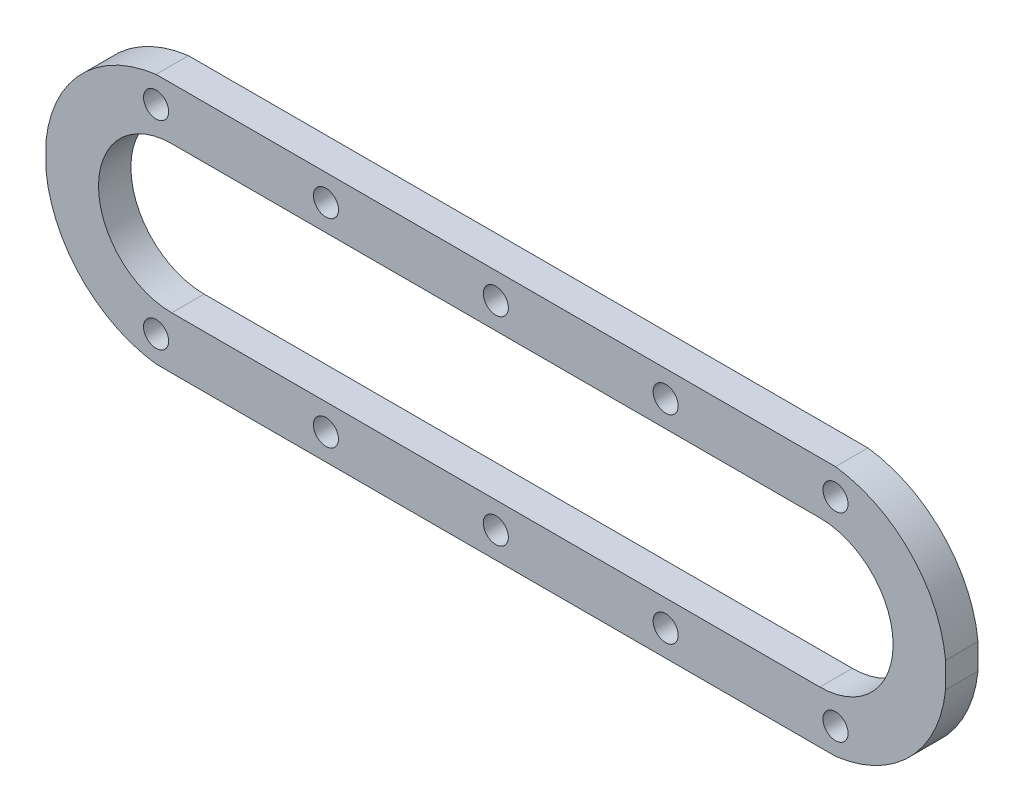
ISO-10303-21;
HEADER;
FILE_DESCRIPTION(('STEP AP214'),'2;1');
FILE_NAME('part.step','',(''),(''),'','','');
FILE_SCHEMA(('AUTOMOTIVE_DESIGN { 1 0 10303 214 1 1 1 1 }'));
ENDSEC;
DATA;
#1=APPLICATION_CONTEXT('core data for automotive mechanical design processes');
#2=APPLICATION_PROTOCOL_DEFINITION('international standard','automotive_design',2000,#1);
#3=PRODUCT_CONTEXT('',#1,'mechanical');
#4=PRODUCT('Part','Part','',(#3));
#5=PRODUCT_RELATED_PRODUCT_CATEGORY('part','',(#4));
#6=PRODUCT_DEFINITION_FORMATION('','',#4);
#7=PRODUCT_DEFINITION_CONTEXT('part definition',#1,'design');
#8=PRODUCT_DEFINITION('design','',#6,#7);
#9=PRODUCT_DEFINITION_SHAPE('','',#8);
#10=(LENGTH_UNIT() NAMED_UNIT(*) SI_UNIT(.MILLI.,.METRE.));
#11=(NAMED_UNIT(*) PLANE_ANGLE_UNIT() SI_UNIT($,.RADIAN.));
#12=(NAMED_UNIT(*) SI_UNIT($,.STERADIAN.) SOLID_ANGLE_UNIT());
#13=UNCERTAINTY_MEASURE_WITH_UNIT(LENGTH_MEASURE(1.E-05),#10,'distance_accuracy_value','');
#14=(GEOMETRIC_REPRESENTATION_CONTEXT(3) GLOBAL_UNCERTAINTY_ASSIGNED_CONTEXT((#13)) GLOBAL_UNIT_ASSIGNED_CONTEXT((#10,
#11,#12)) REPRESENTATION_CONTEXT('',''));
#15=CARTESIAN_POINT('',(0.,0.,0.));
#16=DIRECTION('',(0.,0.,1.));
#17=DIRECTION('',(1.,0.,0.));
#18=AXIS2_PLACEMENT_3D('',#15,#16,#17);
#19=CARTESIAN_POINT('',(0.,0.,0.));
#20=DIRECTION('',(0.,0.,-1.));
#21=DIRECTION('',(-1.,0.,0.));
#22=AXIS2_PLACEMENT_3D('',#19,#20,#21);
#23=PLANE('',#22);
#24=CARTESIAN_POINT('',(-66.5658073569615,19.46275,0.));
#25=DIRECTION('',(0.,0.,1.));
#26=DIRECTION('',(1.,0.,0.));
#27=AXIS2_PLACEMENT_3D('',#24,#25,#26);
#28=CIRCLE('',#27,2.45745);
#29=CARTESIAN_POINT('',(-64.1083573569615,19.46275,0.));
#30=VERTEX_POINT('',#29);
#31=EDGE_CURVE('E272',#30,#30,#28,.T.);
#32=ORIENTED_EDGE('',*,*,#31,.T.);
#33=EDGE_LOOP('',(#32));
#34=FACE_BOUND('',#33,.T.);
#35=CARTESIAN_POINT('',(-33.2829036784807,19.46275,0.));
#36=DIRECTION('',(0.,0.,1.));
#37=DIRECTION('',(1.,0.,0.));
#38=AXIS2_PLACEMENT_3D('',#35,#36,#37);
#39=CIRCLE('',#38,2.45745);
#40=CARTESIAN_POINT('',(-30.8254536784807,19.46275,0.));
#41=VERTEX_POINT('',#40);
#42=EDGE_CURVE('E266',#41,#41,#39,.T.);
#43=ORIENTED_EDGE('',*,*,#42,.T.);
#44=EDGE_LOOP('',(#43));
#45=FACE_BOUND('',#44,.T.);
#46=CARTESIAN_POINT('',(1.11022302462516E-13,19.46275,0.));
#47=DIRECTION('',(0.,0.,1.));
#48=DIRECTION('',(1.,0.,0.));
#49=AXIS2_PLACEMENT_3D('',#46,#47,#48);
#50=CIRCLE('',#49,2.45745);
#51=CARTESIAN_POINT('',(2.45745000000011,19.46275,0.));
#52=VERTEX_POINT('',#51);
#53=EDGE_CURVE('E260',#52,#52,#50,.T.);
#54=ORIENTED_EDGE('',*,*,#53,.T.);
#55=EDGE_LOOP('',(#54));
#56=FACE_BOUND('',#55,.T.);
#57=CARTESIAN_POINT('',(33.2829036784809,19.46275,0.));
#58=DIRECTION('',(0.,0.,1.));
#59=DIRECTION('',(1.,0.,0.));
#60=AXIS2_PLACEMENT_3D('',#57,#58,#59);
#61=CIRCLE('',#60,2.45745);
#62=CARTESIAN_POINT('',(35.7403536784809,19.46275,0.));
#63=VERTEX_POINT('',#62);
#64=EDGE_CURVE('E254',#63,#63,#61,.T.);
#65=ORIENTED_EDGE('',*,*,#64,.T.);
#66=EDGE_LOOP('',(#65));
#67=FACE_BOUND('',#66,.T.);
#68=CARTESIAN_POINT('',(66.5658073569617,19.46275,0.));
#69=DIRECTION('',(0.,0.,1.));
#70=DIRECTION('',(1.,0.,0.));
#71=AXIS2_PLACEMENT_3D('',#68,#69,#70);
#72=CIRCLE('',#71,2.45745);
#73=CARTESIAN_POINT('',(69.0232573569617,19.46275,0.));
#74=VERTEX_POINT('',#73);
#75=EDGE_CURVE('E248',#74,#74,#72,.T.);
#76=ORIENTED_EDGE('',*,*,#75,.T.);
#77=EDGE_LOOP('',(#76));
#78=FACE_BOUND('',#77,.T.);
#79=CARTESIAN_POINT('',(66.5658073569617,-19.46275,0.));
#80=DIRECTION('',(0.,0.,1.));
#81=DIRECTION('',(1.,0.,0.));
#82=AXIS2_PLACEMENT_3D('',#79,#80,#81);
#83=CIRCLE('',#82,2.45745);
#84=CARTESIAN_POINT('',(69.0232573569617,-19.46275,0.));
#85=VERTEX_POINT('',#84);
#86=EDGE_CURVE('E242',#85,#85,#83,.T.);
#87=ORIENTED_EDGE('',*,*,#86,.T.);
#88=EDGE_LOOP('',(#87));
#89=FACE_BOUND('',#88,.T.);
#90=CARTESIAN_POINT('',(33.2829036784809,-19.46275,0.));
#91=DIRECTION('',(0.,0.,1.));
#92=DIRECTION('',(1.,0.,0.));
#93=AXIS2_PLACEMENT_3D('',#90,#91,#92);
#94=CIRCLE('',#93,2.45745);
#95=CARTESIAN_POINT('',(35.7403536784809,-19.46275,0.));
#96=VERTEX_POINT('',#95);
#97=EDGE_CURVE('E236',#96,#96,#94,.T.);
#98=ORIENTED_EDGE('',*,*,#97,.T.);
#99=EDGE_LOOP('',(#98));
#100=FACE_BOUND('',#99,.T.);
#101=DIRECTION('',(1.,0.,0.));
#102=VECTOR('',#101,1.);
#103=CARTESIAN_POINT('',(88.1380000000001,-24.5745,0.));
#104=LINE('',#103,#102);
#105=CARTESIAN_POINT('',(-66.5658073569614,-24.5745,0.));
#106=VERTEX_POINT('',#105);
#107=CARTESIAN_POINT('',(66.5658073569613,-24.5745,0.));
#108=VERTEX_POINT('',#107);
#109=EDGE_CURVE('E144',#106,#108,#104,.T.);
#110=ORIENTED_EDGE('',*,*,#109,.F.);
#111=CARTESIAN_POINT('',(-63.5,0.,0.));
#112=DIRECTION('',(0.,0.,1.));
#113=DIRECTION('',(1.,0.,0.));
#114=AXIS2_PLACEMENT_3D('',#111,#112,#113);
#115=CIRCLE('',#114,24.765);
#116=CARTESIAN_POINT('',(-88.138,-2.50483153126135,0.));
#117=VERTEX_POINT('',#116);
#118=EDGE_CURVE('E211',#117,#106,#115,.T.);
#119=ORIENTED_EDGE('',*,*,#118,.F.);
#120=DIRECTION('',(0.,-1.,0.));
#121=VECTOR('',#120,1.);
#122=CARTESIAN_POINT('',(-88.1379999999999,24.5745,0.));
#123=LINE('',#122,#121);
#124=CARTESIAN_POINT('',(-88.1379999999999,2.50483153126137,0.));
#125=VERTEX_POINT('',#124);
#126=EDGE_CURVE('E147',#125,#117,#123,.T.);
#127=ORIENTED_EDGE('',*,*,#126,.F.);
#128=CARTESIAN_POINT('',(-63.5,0.,0.));
#129=DIRECTION('',(0.,0.,1.));
#130=DIRECTION('',(1.,0.,0.));
#131=AXIS2_PLACEMENT_3D('',#128,#129,#130);
#132=CIRCLE('',#131,24.765);
#133=CARTESIAN_POINT('',(-66.5658073569615,24.5745,0.));
#134=VERTEX_POINT('',#133);
#135=EDGE_CURVE('E194',#134,#125,#132,.T.);
#136=ORIENTED_EDGE('',*,*,#135,.F.);
#137=DIRECTION('',(-1.,0.,0.));
#138=VECTOR('',#137,1.);
#139=CARTESIAN_POINT('',(88.1380000000001,24.5745,0.));
#140=LINE('',#139,#138);
#141=CARTESIAN_POINT('',(66.5658073569617,24.5745,0.));
#142=VERTEX_POINT('',#141);
#143=EDGE_CURVE('E39',#142,#134,#140,.T.);
#144=ORIENTED_EDGE('',*,*,#143,.F.);
#145=CARTESIAN_POINT('',(63.5,0.,0.));
#146=DIRECTION('',(0.,0.,1.));
#147=DIRECTION('',(1.,0.,0.));
#148=AXIS2_PLACEMENT_3D('',#145,#146,#147);
#149=CIRCLE('',#148,24.765);
#150=CARTESIAN_POINT('',(88.138,2.50483153126059,0.));
#151=VERTEX_POINT('',#150);
#152=EDGE_CURVE('E143',#142,#151,#149,.F.);
#153=ORIENTED_EDGE('',*,*,#152,.T.);
#154=DIRECTION('',(0.,1.,0.));
#155=VECTOR('',#154,1.);
#156=CARTESIAN_POINT('',(88.1380000000001,24.5745,0.));
#157=LINE('',#156,#155);
#158=CARTESIAN_POINT('',(88.1380000000001,-2.50483153126051,0.));
#159=VERTEX_POINT('',#158);
#160=EDGE_CURVE('E138',#159,#151,#157,.T.);
#161=ORIENTED_EDGE('',*,*,#160,.F.);
#162=CARTESIAN_POINT('',(63.5,0.,0.));
#163=DIRECTION('',(0.,0.,1.));
#164=DIRECTION('',(1.,0.,0.));
#165=AXIS2_PLACEMENT_3D('',#162,#163,#164);
#166=CIRCLE('',#165,24.765);
#167=EDGE_CURVE('E123',#159,#108,#166,.F.);
#168=ORIENTED_EDGE('',*,*,#167,.T.);
#169=EDGE_LOOP('',(#110,#119,#127,#136,#144,#153,#161,#168));
#170=FACE_BOUND('',#169,.T.);
#171=CARTESIAN_POINT('',(63.5,0.,0.));
#172=DIRECTION('',(0.,0.,1.));
#173=DIRECTION('',(1.,0.,0.));
#174=AXIS2_PLACEMENT_3D('',#171,#172,#173);
#175=CIRCLE('',#174,14.351);
#176=CARTESIAN_POINT('',(63.5,-14.351,0.));
#177=VERTEX_POINT('',#176);
#178=CARTESIAN_POINT('',(63.5,14.351,0.));
#179=VERTEX_POINT('',#178);
#180=EDGE_CURVE('E171',#177,#179,#175,.T.);
#181=ORIENTED_EDGE('',*,*,#180,.T.);
#182=DIRECTION('',(-1.,0.,0.));
#183=VECTOR('',#182,1.);
#184=CARTESIAN_POINT('',(63.5,14.351,0.));
#185=LINE('',#184,#183);
#186=CARTESIAN_POINT('',(-63.5,14.351,0.));
#187=VERTEX_POINT('',#186);
#188=EDGE_CURVE('E186',#179,#187,#185,.T.);
#189=ORIENTED_EDGE('',*,*,#188,.T.);
#190=CARTESIAN_POINT('',(-63.5,0.,0.));
#191=DIRECTION('',(0.,0.,1.));
#192=DIRECTION('',(1.,0.,0.));
#193=AXIS2_PLACEMENT_3D('',#190,#191,#192);
#194=CIRCLE('',#193,14.351);
#195=CARTESIAN_POINT('',(-63.5,-14.351,0.));
#196=VERTEX_POINT('',#195);
#197=EDGE_CURVE('E183',#187,#196,#194,.T.);
#198=ORIENTED_EDGE('',*,*,#197,.T.);
#199=DIRECTION('',(1.,0.,0.));
#200=VECTOR('',#199,1.);
#201=CARTESIAN_POINT('',(63.5,-14.351,0.));
#202=LINE('',#201,#200);
#203=EDGE_CURVE('E163',#196,#177,#202,.T.);
#204=ORIENTED_EDGE('',*,*,#203,.T.);
#205=EDGE_LOOP('',(#181,#189,#198,#204));
#206=FACE_BOUND('',#205,.T.);
#207=CARTESIAN_POINT('',(-66.5658073569615,-19.46275,0.));
#208=DIRECTION('',(0.,0.,1.));
#209=DIRECTION('',(1.,0.,0.));
#210=AXIS2_PLACEMENT_3D('',#207,#208,#209);
#211=CIRCLE('',#210,2.45745);
#212=CARTESIAN_POINT('',(-64.1083573569615,-19.46275,0.));
#213=VERTEX_POINT('',#212);
#214=EDGE_CURVE('E217',#213,#213,#211,.T.);
#215=ORIENTED_EDGE('',*,*,#214,.T.);
#216=EDGE_LOOP('',(#215));
#217=FACE_BOUND('',#216,.T.);
#218=CARTESIAN_POINT('',(-33.2829036784807,-19.46275,0.));
#219=DIRECTION('',(0.,0.,1.));
#220=DIRECTION('',(1.,0.,0.));
#221=AXIS2_PLACEMENT_3D('',#218,#219,#220);
#222=CIRCLE('',#221,2.45745);
#223=CARTESIAN_POINT('',(-30.8254536784807,-19.46275,0.));
#224=VERTEX_POINT('',#223);
#225=EDGE_CURVE('E224',#224,#224,#222,.T.);
#226=ORIENTED_EDGE('',*,*,#225,.T.);
#227=EDGE_LOOP('',(#226));
#228=FACE_BOUND('',#227,.T.);
#229=CARTESIAN_POINT('',(0.,-19.46275,0.));
#230=DIRECTION('',(0.,0.,1.));
#231=DIRECTION('',(1.,0.,0.));
#232=AXIS2_PLACEMENT_3D('',#229,#230,#231);
#233=CIRCLE('',#232,2.45745);
#234=CARTESIAN_POINT('',(2.45744999999999,-19.46275,0.));
#235=VERTEX_POINT('',#234);
#236=EDGE_CURVE('E230',#235,#235,#233,.T.);
#237=ORIENTED_EDGE('',*,*,#236,.T.);
#238=EDGE_LOOP('',(#237));
#239=FACE_BOUND('',#238,.T.);
#240=ADVANCED_FACE('F35',(#34,#45,#56,#67,#78,#89,#100,#170,#206,#217,#228,#239),#23,.T.);
#241=CARTESIAN_POINT('',(-88.1379999999999,24.5745,6.35));
#242=DIRECTION('',(1.,0.,0.));
#243=DIRECTION('',(0.,1.,0.));
#244=AXIS2_PLACEMENT_3D('',#241,#242,#243);
#245=PLANE('',#244);
#246=DIRECTION('',(0.,0.,1.));
#247=VECTOR('',#246,1.);
#248=CARTESIAN_POINT('',(-88.1379999999999,-2.50483153126135,0.));
#249=LINE('',#248,#247);
#250=CARTESIAN_POINT('',(-88.1379999999999,-2.50483153126135,6.35));
#251=VERTEX_POINT('',#250);
#252=EDGE_CURVE('E208',#117,#251,#249,.T.);
#253=ORIENTED_EDGE('',*,*,#252,.T.);
#254=DIRECTION('',(0.,-1.,0.));
#255=VECTOR('',#254,1.);
#256=CARTESIAN_POINT('',(-88.1379999999999,24.5745,6.35));
#257=LINE('',#256,#255);
#258=CARTESIAN_POINT('',(-88.1379999999999,2.50483153126137,6.35));
#259=VERTEX_POINT('',#258);
#260=EDGE_CURVE('E146',#259,#251,#257,.T.);
#261=ORIENTED_EDGE('',*,*,#260,.F.);
#262=DIRECTION('',(0.,0.,1.));
#263=VECTOR('',#262,1.);
#264=CARTESIAN_POINT('',(-88.1379999999999,2.50483153126137,0.));
#265=LINE('',#264,#263);
#266=EDGE_CURVE('E180',#125,#259,#265,.T.);
#267=ORIENTED_EDGE('',*,*,#266,.F.);
#268=ORIENTED_EDGE('',*,*,#126,.T.);
#269=EDGE_LOOP('',(#253,#261,#267,#268));
#270=FACE_BOUND('',#269,.T.);
#271=ADVANCED_FACE('F37',(#270),#245,.F.);
#272=CARTESIAN_POINT('',(88.1380000000001,-24.5745,6.35));
#273=DIRECTION('',(0.,1.,0.));
#274=DIRECTION('',(-1.,0.,0.));
#275=AXIS2_PLACEMENT_3D('',#272,#273,#274);
#276=PLANE('',#275);
#277=DIRECTION('',(0.,0.,1.));
#278=VECTOR('',#277,1.);
#279=CARTESIAN_POINT('',(-66.5658073569614,-24.5745,0.));
#280=LINE('',#279,#278);
#281=CARTESIAN_POINT('',(-66.5658073569614,-24.5745,6.35));
#282=VERTEX_POINT('',#281);
#283=EDGE_CURVE('E199',#106,#282,#280,.T.);
#284=ORIENTED_EDGE('',*,*,#283,.F.);
#285=ORIENTED_EDGE('',*,*,#109,.T.);
#286=DIRECTION('',(0.,0.,1.));
#287=VECTOR('',#286,1.);
#288=CARTESIAN_POINT('',(66.5658073569613,-24.5745,0.));
#289=LINE('',#288,#287);
#290=CARTESIAN_POINT('',(66.5658073569613,-24.5745,6.35));
#291=VERTEX_POINT('',#290);
#292=EDGE_CURVE('E52',#108,#291,#289,.T.);
#293=ORIENTED_EDGE('',*,*,#292,.T.);
#294=DIRECTION('',(1.,0.,0.));
#295=VECTOR('',#294,1.);
#296=CARTESIAN_POINT('',(88.1380000000001,-24.5745,6.35));
#297=LINE('',#296,#295);
#298=EDGE_CURVE('E154',#282,#291,#297,.T.);
#299=ORIENTED_EDGE('',*,*,#298,.F.);
#300=EDGE_LOOP('',(#284,#285,#293,#299));
#301=FACE_BOUND('',#300,.T.);
#302=ADVANCED_FACE('F313',(#301),#276,.F.);
#303=CARTESIAN_POINT('',(88.1380000000001,24.5745,6.35));
#304=DIRECTION('',(0.,-1.,0.));
#305=DIRECTION('',(1.,0.,0.));
#306=AXIS2_PLACEMENT_3D('',#303,#304,#305);
#307=PLANE('',#306);
#308=DIRECTION('',(-1.,0.,0.));
#309=VECTOR('',#308,1.);
#310=CARTESIAN_POINT('',(88.1380000000001,24.5745,6.35));
#311=LINE('',#310,#309);
#312=CARTESIAN_POINT('',(66.5658073569617,24.5745,6.35));
#313=VERTEX_POINT('',#312);
#314=CARTESIAN_POINT('',(-66.5658073569615,24.5745,6.35));
#315=VERTEX_POINT('',#314);
#316=EDGE_CURVE('E11',#313,#315,#311,.T.);
#317=ORIENTED_EDGE('',*,*,#316,.F.);
#318=DIRECTION('',(0.,0.,1.));
#319=VECTOR('',#318,1.);
#320=CARTESIAN_POINT('',(66.5658073569617,24.5745,0.));
#321=LINE('',#320,#319);
#322=EDGE_CURVE('E201',#142,#313,#321,.T.);
#323=ORIENTED_EDGE('',*,*,#322,.F.);
#324=ORIENTED_EDGE('',*,*,#143,.T.);
#325=DIRECTION('',(0.,0.,1.));
#326=VECTOR('',#325,1.);
#327=CARTESIAN_POINT('',(-66.5658073569615,24.5745,0.));
#328=LINE('',#327,#326);
#329=EDGE_CURVE('E191',#134,#315,#328,.T.);
#330=ORIENTED_EDGE('',*,*,#329,.T.);
#331=EDGE_LOOP('',(#317,#323,#324,#330));
#332=FACE_BOUND('',#331,.T.);
#333=ADVANCED_FACE('F284',(#332),#307,.F.);
#334=CARTESIAN_POINT('',(0.,0.,6.35));
#335=DIRECTION('',(0.,0.,-1.));
#336=DIRECTION('',(-1.,0.,0.));
#337=AXIS2_PLACEMENT_3D('',#334,#335,#336);
#338=PLANE('',#337);
#339=CARTESIAN_POINT('',(-66.5658073569615,19.46275,6.35));
#340=DIRECTION('',(0.,0.,1.));
#341=DIRECTION('',(1.,0.,0.));
#342=AXIS2_PLACEMENT_3D('',#339,#340,#341);
#343=CIRCLE('',#342,2.45744999999999);
#344=CARTESIAN_POINT('',(-64.1083573569615,19.46275,6.35));
#345=VERTEX_POINT('',#344);
#346=EDGE_CURVE('E275',#345,#345,#343,.T.);
#347=ORIENTED_EDGE('',*,*,#346,.F.);
#348=EDGE_LOOP('',(#347));
#349=FACE_BOUND('',#348,.T.);
#350=CARTESIAN_POINT('',(-33.2829036784807,19.46275,6.35));
#351=DIRECTION('',(0.,0.,1.));
#352=DIRECTION('',(1.,0.,0.));
#353=AXIS2_PLACEMENT_3D('',#350,#351,#352);
#354=CIRCLE('',#353,2.45744999999999);
#355=CARTESIAN_POINT('',(-30.8254536784807,19.46275,6.35));
#356=VERTEX_POINT('',#355);
#357=EDGE_CURVE('E269',#356,#356,#354,.T.);
#358=ORIENTED_EDGE('',*,*,#357,.F.);
#359=EDGE_LOOP('',(#358));
#360=FACE_BOUND('',#359,.T.);
#361=CARTESIAN_POINT('',(1.11022302462516E-13,19.46275,6.35));
#362=DIRECTION('',(0.,0.,1.));
#363=DIRECTION('',(1.,0.,0.));
#364=AXIS2_PLACEMENT_3D('',#361,#362,#363);
#365=CIRCLE('',#364,2.45744999999999);
#366=CARTESIAN_POINT('',(2.4574500000001,19.46275,6.35));
#367=VERTEX_POINT('',#366);
#368=EDGE_CURVE('E263',#367,#367,#365,.T.);
#369=ORIENTED_EDGE('',*,*,#368,.F.);
#370=EDGE_LOOP('',(#369));
#371=FACE_BOUND('',#370,.T.);
#372=CARTESIAN_POINT('',(33.2829036784809,19.46275,6.35));
#373=DIRECTION('',(0.,0.,1.));
#374=DIRECTION('',(1.,0.,0.));
#375=AXIS2_PLACEMENT_3D('',#372,#373,#374);
#376=CIRCLE('',#375,2.45744999999999);
#377=CARTESIAN_POINT('',(35.7403536784809,19.46275,6.35));
#378=VERTEX_POINT('',#377);
#379=EDGE_CURVE('E257',#378,#378,#376,.T.);
#380=ORIENTED_EDGE('',*,*,#379,.F.);
#381=EDGE_LOOP('',(#380));
#382=FACE_BOUND('',#381,.T.);
#383=CARTESIAN_POINT('',(66.5658073569617,19.46275,6.35));
#384=DIRECTION('',(0.,0.,1.));
#385=DIRECTION('',(1.,0.,0.));
#386=AXIS2_PLACEMENT_3D('',#383,#384,#385);
#387=CIRCLE('',#386,2.45744999999999);
#388=CARTESIAN_POINT('',(69.0232573569617,19.46275,6.35));
#389=VERTEX_POINT('',#388);
#390=EDGE_CURVE('E251',#389,#389,#387,.T.);
#391=ORIENTED_EDGE('',*,*,#390,.F.);
#392=EDGE_LOOP('',(#391));
#393=FACE_BOUND('',#392,.T.);
#394=CARTESIAN_POINT('',(66.5658073569617,-19.46275,6.35));
#395=DIRECTION('',(0.,0.,1.));
#396=DIRECTION('',(1.,0.,0.));
#397=AXIS2_PLACEMENT_3D('',#394,#395,#396);
#398=CIRCLE('',#397,2.45744999999999);
#399=CARTESIAN_POINT('',(69.0232573569617,-19.46275,6.35));
#400=VERTEX_POINT('',#399);
#401=EDGE_CURVE('E245',#400,#400,#398,.T.);
#402=ORIENTED_EDGE('',*,*,#401,.F.);
#403=EDGE_LOOP('',(#402));
#404=FACE_BOUND('',#403,.T.);
#405=CARTESIAN_POINT('',(33.2829036784809,-19.46275,6.35));
#406=DIRECTION('',(0.,0.,1.));
#407=DIRECTION('',(1.,0.,0.));
#408=AXIS2_PLACEMENT_3D('',#405,#406,#407);
#409=CIRCLE('',#408,2.45744999999999);
#410=CARTESIAN_POINT('',(35.7403536784809,-19.46275,6.35));
#411=VERTEX_POINT('',#410);
#412=EDGE_CURVE('E239',#411,#411,#409,.T.);
#413=ORIENTED_EDGE('',*,*,#412,.F.);
#414=EDGE_LOOP('',(#413));
#415=FACE_BOUND('',#414,.T.);
#416=CARTESIAN_POINT('',(0.,-19.46275,6.35));
#417=DIRECTION('',(0.,0.,1.));
#418=DIRECTION('',(1.,0.,0.));
#419=AXIS2_PLACEMENT_3D('',#416,#417,#418);
#420=CIRCLE('',#419,2.45744999999999);
#421=CARTESIAN_POINT('',(2.45744999999998,-19.46275,6.35));
#422=VERTEX_POINT('',#421);
#423=EDGE_CURVE('E233',#422,#422,#420,.T.);
#424=ORIENTED_EDGE('',*,*,#423,.F.);
#425=EDGE_LOOP('',(#424));
#426=FACE_BOUND('',#425,.T.);
#427=CARTESIAN_POINT('',(-33.2829036784807,-19.46275,6.35));
#428=DIRECTION('',(0.,0.,1.));
#429=DIRECTION('',(1.,0.,0.));
#430=AXIS2_PLACEMENT_3D('',#427,#428,#429);
#431=CIRCLE('',#430,2.45744999999999);
#432=CARTESIAN_POINT('',(-30.8254536784807,-19.46275,6.35));
#433=VERTEX_POINT('',#432);
#434=EDGE_CURVE('E227',#433,#433,#431,.T.);
#435=ORIENTED_EDGE('',*,*,#434,.F.);
#436=EDGE_LOOP('',(#435));
#437=FACE_BOUND('',#436,.T.);
#438=CARTESIAN_POINT('',(-66.5658073569615,-19.46275,6.35));
#439=DIRECTION('',(0.,0.,1.));
#440=DIRECTION('',(1.,0.,0.));
#441=AXIS2_PLACEMENT_3D('',#438,#439,#440);
#442=CIRCLE('',#441,2.45744999999999);
#443=CARTESIAN_POINT('',(-64.1083573569615,-19.46275,6.35));
#444=VERTEX_POINT('',#443);
#445=EDGE_CURVE('E221',#444,#444,#442,.T.);
#446=ORIENTED_EDGE('',*,*,#445,.F.);
#447=EDGE_LOOP('',(#446));
#448=FACE_BOUND('',#447,.T.);
#449=DIRECTION('',(-1.,0.,0.));
#450=VECTOR('',#449,1.);
#451=CARTESIAN_POINT('',(63.5,14.351,6.35));
#452=LINE('',#451,#450);
#453=CARTESIAN_POINT('',(63.5,14.351,6.35));
#454=VERTEX_POINT('',#453);
#455=CARTESIAN_POINT('',(-63.5,14.351,6.35));
#456=VERTEX_POINT('',#455);
#457=EDGE_CURVE('E175',#454,#456,#452,.T.);
#458=ORIENTED_EDGE('',*,*,#457,.F.);
#459=CARTESIAN_POINT('',(63.5,0.,6.35));
#460=DIRECTION('',(0.,0.,1.));
#461=DIRECTION('',(1.,0.,0.));
#462=AXIS2_PLACEMENT_3D('',#459,#460,#461);
#463=CIRCLE('',#462,14.351);
#464=CARTESIAN_POINT('',(63.5,-14.351,6.35));
#465=VERTEX_POINT('',#464);
#466=EDGE_CURVE('E178',#465,#454,#463,.T.);
#467=ORIENTED_EDGE('',*,*,#466,.F.);
#468=DIRECTION('',(1.,0.,0.));
#469=VECTOR('',#468,1.);
#470=CARTESIAN_POINT('',(63.5,-14.351,6.35));
#471=LINE('',#470,#469);
#472=CARTESIAN_POINT('',(-63.5,-14.351,6.35));
#473=VERTEX_POINT('',#472);
#474=EDGE_CURVE('E168',#473,#465,#471,.T.);
#475=ORIENTED_EDGE('',*,*,#474,.F.);
#476=CARTESIAN_POINT('',(-63.5,0.,6.35));
#477=DIRECTION('',(0.,0.,1.));
#478=DIRECTION('',(1.,0.,0.));
#479=AXIS2_PLACEMENT_3D('',#476,#477,#478);
#480=CIRCLE('',#479,14.351);
#481=EDGE_CURVE('E172',#456,#473,#480,.T.);
#482=ORIENTED_EDGE('',*,*,#481,.F.);
#483=EDGE_LOOP('',(#458,#467,#475,#482));
#484=FACE_BOUND('',#483,.T.);
#485=CARTESIAN_POINT('',(-63.5,0.,6.35));
#486=DIRECTION('',(0.,0.,1.));
#487=DIRECTION('',(1.,0.,0.));
#488=AXIS2_PLACEMENT_3D('',#485,#486,#487);
#489=CIRCLE('',#488,24.765);
#490=EDGE_CURVE('E204',#251,#282,#489,.T.);
#491=ORIENTED_EDGE('',*,*,#490,.T.);
#492=ORIENTED_EDGE('',*,*,#298,.T.);
#493=CARTESIAN_POINT('',(63.5,0.,6.35));
#494=DIRECTION('',(0.,0.,1.));
#495=DIRECTION('',(1.,0.,0.));
#496=AXIS2_PLACEMENT_3D('',#493,#494,#495);
#497=CIRCLE('',#496,24.765);
#498=CARTESIAN_POINT('',(88.1380000000001,-2.50483153126051,6.35));
#499=VERTEX_POINT('',#498);
#500=EDGE_CURVE('E132',#499,#291,#497,.F.);
#501=ORIENTED_EDGE('',*,*,#500,.F.);
#502=DIRECTION('',(0.,1.,0.));
#503=VECTOR('',#502,1.);
#504=CARTESIAN_POINT('',(88.1380000000001,24.5745,6.35));
#505=LINE('',#504,#503);
#506=CARTESIAN_POINT('',(88.1380000000001,2.50483153126057,6.35));
#507=VERTEX_POINT('',#506);
#508=EDGE_CURVE('E44',#499,#507,#505,.T.);
#509=ORIENTED_EDGE('',*,*,#508,.T.);
#510=CARTESIAN_POINT('',(63.5,0.,6.35));
#511=DIRECTION('',(0.,0.,1.));
#512=DIRECTION('',(1.,0.,0.));
#513=AXIS2_PLACEMENT_3D('',#510,#511,#512);
#514=CIRCLE('',#513,24.765);
#515=EDGE_CURVE('E205',#313,#507,#514,.F.);
#516=ORIENTED_EDGE('',*,*,#515,.F.);
#517=ORIENTED_EDGE('',*,*,#316,.T.);
#518=CARTESIAN_POINT('',(-63.5,0.,6.35));
#519=DIRECTION('',(0.,0.,1.));
#520=DIRECTION('',(1.,0.,0.));
#521=AXIS2_PLACEMENT_3D('',#518,#519,#520);
#522=CIRCLE('',#521,24.765);
#523=EDGE_CURVE('E196',#315,#259,#522,.T.);
#524=ORIENTED_EDGE('',*,*,#523,.T.);
#525=ORIENTED_EDGE('',*,*,#260,.T.);
#526=EDGE_LOOP('',(#491,#492,#501,#509,#516,#517,#524,#525));
#527=FACE_BOUND('',#526,.T.);
#528=ADVANCED_FACE('F281',(#349,#360,#371,#382,#393,#404,#415,#426,#437,#448,#484,#527),#338,.F.);
#529=CARTESIAN_POINT('',(88.1380000000001,24.5745,6.35));
#530=DIRECTION('',(-1.,0.,0.));
#531=DIRECTION('',(0.,0.,1.));
#532=AXIS2_PLACEMENT_3D('',#529,#530,#531);
#533=PLANE('',#532);
#534=ORIENTED_EDGE('',*,*,#160,.T.);
#535=DIRECTION('',(0.,0.,1.));
#536=VECTOR('',#535,1.);
#537=CARTESIAN_POINT('',(88.1380000000001,2.50483153126057,0.));
#538=LINE('',#537,#536);
#539=EDGE_CURVE('E60',#151,#507,#538,.T.);
#540=ORIENTED_EDGE('',*,*,#539,.T.);
#541=ORIENTED_EDGE('',*,*,#508,.F.);
#542=DIRECTION('',(0.,0.,1.));
#543=VECTOR('',#542,1.);
#544=CARTESIAN_POINT('',(88.1380000000001,-2.50483153126051,0.));
#545=LINE('',#544,#543);
#546=EDGE_CURVE('E126',#159,#499,#545,.T.);
#547=ORIENTED_EDGE('',*,*,#546,.F.);
#548=EDGE_LOOP('',(#534,#540,#541,#547));
#549=FACE_BOUND('',#548,.T.);
#550=ADVANCED_FACE('F137',(#549),#533,.F.);
#551=CARTESIAN_POINT('',(63.5,0.,0.));
#552=DIRECTION('',(0.,0.,1.));
#553=DIRECTION('',(1.,0.,0.));
#554=AXIS2_PLACEMENT_3D('',#551,#552,#553);
#555=CYLINDRICAL_SURFACE('',#554,14.351);
#556=ORIENTED_EDGE('',*,*,#466,.T.);
#557=DIRECTION('',(0.,0.,1.));
#558=VECTOR('',#557,1.);
#559=CARTESIAN_POINT('',(63.5,14.351,0.));
#560=LINE('',#559,#558);
#561=EDGE_CURVE('E159',#179,#454,#560,.T.);
#562=ORIENTED_EDGE('',*,*,#561,.F.);
#563=ORIENTED_EDGE('',*,*,#180,.F.);
#564=DIRECTION('',(0.,0.,1.));
#565=VECTOR('',#564,1.);
#566=CARTESIAN_POINT('',(63.5,-14.351,0.));
#567=LINE('',#566,#565);
#568=EDGE_CURVE('E151',#177,#465,#567,.T.);
#569=ORIENTED_EDGE('',*,*,#568,.T.);
#570=EDGE_LOOP('',(#556,#562,#563,#569));
#571=FACE_BOUND('',#570,.T.);
#572=ADVANCED_FACE('F349',(#571),#555,.F.);
#573=CARTESIAN_POINT('',(63.5,-14.351,0.));
#574=DIRECTION('',(0.,-1.,0.));
#575=DIRECTION('',(1.,0.,0.));
#576=AXIS2_PLACEMENT_3D('',#573,#574,#575);
#577=PLANE('',#576);
#578=ORIENTED_EDGE('',*,*,#474,.T.);
#579=ORIENTED_EDGE('',*,*,#568,.F.);
#580=ORIENTED_EDGE('',*,*,#203,.F.);
#581=DIRECTION('',(0.,0.,1.));
#582=VECTOR('',#581,1.);
#583=CARTESIAN_POINT('',(-63.5,-14.351,0.));
#584=LINE('',#583,#582);
#585=EDGE_CURVE('E165',#196,#473,#584,.T.);
#586=ORIENTED_EDGE('',*,*,#585,.T.);
#587=EDGE_LOOP('',(#578,#579,#580,#586));
#588=FACE_BOUND('',#587,.T.);
#589=ADVANCED_FACE('F375',(#588),#577,.F.);
#590=CARTESIAN_POINT('',(-63.5,0.,0.));
#591=DIRECTION('',(0.,0.,1.));
#592=DIRECTION('',(1.,0.,0.));
#593=AXIS2_PLACEMENT_3D('',#590,#591,#592);
#594=CYLINDRICAL_SURFACE('',#593,14.351);
#595=ORIENTED_EDGE('',*,*,#481,.T.);
#596=ORIENTED_EDGE('',*,*,#585,.F.);
#597=ORIENTED_EDGE('',*,*,#197,.F.);
#598=DIRECTION('',(0.,0.,1.));
#599=VECTOR('',#598,1.);
#600=CARTESIAN_POINT('',(-63.5,14.351,0.));
#601=LINE('',#600,#599);
#602=EDGE_CURVE('E162',#187,#456,#601,.T.);
#603=ORIENTED_EDGE('',*,*,#602,.T.);
#604=EDGE_LOOP('',(#595,#596,#597,#603));
#605=FACE_BOUND('',#604,.T.);
#606=ADVANCED_FACE('F382',(#605),#594,.F.);
#607=CARTESIAN_POINT('',(63.5,14.351,0.));
#608=DIRECTION('',(0.,1.,0.));
#609=DIRECTION('',(-1.,0.,0.));
#610=AXIS2_PLACEMENT_3D('',#607,#608,#609);
#611=PLANE('',#610);
#612=ORIENTED_EDGE('',*,*,#457,.T.);
#613=ORIENTED_EDGE('',*,*,#602,.F.);
#614=ORIENTED_EDGE('',*,*,#188,.F.);
#615=ORIENTED_EDGE('',*,*,#561,.T.);
#616=EDGE_LOOP('',(#612,#613,#614,#615));
#617=FACE_BOUND('',#616,.T.);
#618=ADVANCED_FACE('F390',(#617),#611,.F.);
#619=CARTESIAN_POINT('',(-63.5,0.,0.));
#620=DIRECTION('',(0.,0.,1.));
#621=DIRECTION('',(1.,0.,0.));
#622=AXIS2_PLACEMENT_3D('',#619,#620,#621);
#623=CYLINDRICAL_SURFACE('',#622,24.765);
#624=ORIENTED_EDGE('',*,*,#523,.F.);
#625=ORIENTED_EDGE('',*,*,#329,.F.);
#626=ORIENTED_EDGE('',*,*,#135,.T.);
#627=ORIENTED_EDGE('',*,*,#266,.T.);
#628=EDGE_LOOP('',(#624,#625,#626,#627));
#629=FACE_BOUND('',#628,.T.);
#630=ADVANCED_FACE('F320',(#629),#623,.T.);
#631=CARTESIAN_POINT('',(63.5,0.,0.));
#632=DIRECTION('',(0.,0.,1.));
#633=DIRECTION('',(1.,0.,0.));
#634=AXIS2_PLACEMENT_3D('',#631,#632,#633);
#635=CYLINDRICAL_SURFACE('',#634,24.765);
#636=ORIENTED_EDGE('',*,*,#500,.T.);
#637=ORIENTED_EDGE('',*,*,#292,.F.);
#638=ORIENTED_EDGE('',*,*,#167,.F.);
#639=ORIENTED_EDGE('',*,*,#546,.T.);
#640=EDGE_LOOP('',(#636,#637,#638,#639));
#641=FACE_BOUND('',#640,.T.);
#642=ADVANCED_FACE('F125',(#641),#635,.T.);
#643=CARTESIAN_POINT('',(63.5,0.,0.));
#644=DIRECTION('',(0.,0.,1.));
#645=DIRECTION('',(1.,0.,0.));
#646=AXIS2_PLACEMENT_3D('',#643,#644,#645);
#647=CYLINDRICAL_SURFACE('',#646,24.765);
#648=ORIENTED_EDGE('',*,*,#515,.T.);
#649=ORIENTED_EDGE('',*,*,#539,.F.);
#650=ORIENTED_EDGE('',*,*,#152,.F.);
#651=ORIENTED_EDGE('',*,*,#322,.T.);
#652=EDGE_LOOP('',(#648,#649,#650,#651));
#653=FACE_BOUND('',#652,.T.);
#654=ADVANCED_FACE('F325',(#653),#647,.T.);
#655=CARTESIAN_POINT('',(-63.5,0.,0.));
#656=DIRECTION('',(0.,0.,1.));
#657=DIRECTION('',(1.,0.,0.));
#658=AXIS2_PLACEMENT_3D('',#655,#656,#657);
#659=CYLINDRICAL_SURFACE('',#658,24.765);
#660=ORIENTED_EDGE('',*,*,#490,.F.);
#661=ORIENTED_EDGE('',*,*,#252,.F.);
#662=ORIENTED_EDGE('',*,*,#118,.T.);
#663=ORIENTED_EDGE('',*,*,#283,.T.);
#664=EDGE_LOOP('',(#660,#661,#662,#663));
#665=FACE_BOUND('',#664,.T.);
#666=ADVANCED_FACE('F327',(#665),#659,.T.);
#667=CARTESIAN_POINT('',(-66.5658073569615,-19.46275,6.35));
#668=DIRECTION('',(0.,0.,1.));
#669=DIRECTION('',(1.,0.,0.));
#670=AXIS2_PLACEMENT_3D('',#667,#668,#669);
#671=CYLINDRICAL_SURFACE('',#670,2.45744999999999);
#672=ORIENTED_EDGE('',*,*,#214,.F.);
#673=EDGE_LOOP('',(#672));
#674=FACE_BOUND('',#673,.T.);
#675=ORIENTED_EDGE('',*,*,#445,.T.);
#676=EDGE_LOOP('',(#675));
#677=FACE_BOUND('',#676,.T.);
#678=ADVANCED_FACE('F333',(#674,#677),#671,.F.);
#679=CARTESIAN_POINT('',(-33.2829036784807,-19.46275,6.35));
#680=DIRECTION('',(0.,0.,1.));
#681=DIRECTION('',(1.,0.,0.));
#682=AXIS2_PLACEMENT_3D('',#679,#680,#681);
#683=CYLINDRICAL_SURFACE('',#682,2.45744999999999);
#684=ORIENTED_EDGE('',*,*,#225,.F.);
#685=EDGE_LOOP('',(#684));
#686=FACE_BOUND('',#685,.T.);
#687=ORIENTED_EDGE('',*,*,#434,.T.);
#688=EDGE_LOOP('',(#687));
#689=FACE_BOUND('',#688,.T.);
#690=ADVANCED_FACE('F430',(#686,#689),#683,.F.);
#691=CARTESIAN_POINT('',(0.,-19.46275,6.35));
#692=DIRECTION('',(0.,0.,1.));
#693=DIRECTION('',(1.,0.,0.));
#694=AXIS2_PLACEMENT_3D('',#691,#692,#693);
#695=CYLINDRICAL_SURFACE('',#694,2.45744999999999);
#696=ORIENTED_EDGE('',*,*,#236,.F.);
#697=EDGE_LOOP('',(#696));
#698=FACE_BOUND('',#697,.T.);
#699=ORIENTED_EDGE('',*,*,#423,.T.);
#700=EDGE_LOOP('',(#699));
#701=FACE_BOUND('',#700,.T.);
#702=ADVANCED_FACE('F439',(#698,#701),#695,.F.);
#703=CARTESIAN_POINT('',(33.2829036784809,-19.46275,6.35));
#704=DIRECTION('',(0.,0.,1.));
#705=DIRECTION('',(1.,0.,0.));
#706=AXIS2_PLACEMENT_3D('',#703,#704,#705);
#707=CYLINDRICAL_SURFACE('',#706,2.45744999999999);
#708=ORIENTED_EDGE('',*,*,#97,.F.);
#709=EDGE_LOOP('',(#708));
#710=FACE_BOUND('',#709,.T.);
#711=ORIENTED_EDGE('',*,*,#412,.T.);
#712=EDGE_LOOP('',(#711));
#713=FACE_BOUND('',#712,.T.);
#714=ADVANCED_FACE('F448',(#710,#713),#707,.F.);
#715=CARTESIAN_POINT('',(66.5658073569617,-19.46275,6.35));
#716=DIRECTION('',(0.,0.,1.));
#717=DIRECTION('',(1.,0.,0.));
#718=AXIS2_PLACEMENT_3D('',#715,#716,#717);
#719=CYLINDRICAL_SURFACE('',#718,2.45744999999999);
#720=ORIENTED_EDGE('',*,*,#86,.F.);
#721=EDGE_LOOP('',(#720));
#722=FACE_BOUND('',#721,.T.);
#723=ORIENTED_EDGE('',*,*,#401,.T.);
#724=EDGE_LOOP('',(#723));
#725=FACE_BOUND('',#724,.T.);
#726=ADVANCED_FACE('F457',(#722,#725),#719,.F.);
#727=CARTESIAN_POINT('',(66.5658073569617,19.46275,6.35));
#728=DIRECTION('',(0.,0.,1.));
#729=DIRECTION('',(1.,0.,0.));
#730=AXIS2_PLACEMENT_3D('',#727,#728,#729);
#731=CYLINDRICAL_SURFACE('',#730,2.45744999999999);
#732=ORIENTED_EDGE('',*,*,#75,.F.);
#733=EDGE_LOOP('',(#732));
#734=FACE_BOUND('',#733,.T.);
#735=ORIENTED_EDGE('',*,*,#390,.T.);
#736=EDGE_LOOP('',(#735));
#737=FACE_BOUND('',#736,.T.);
#738=ADVANCED_FACE('F466',(#734,#737),#731,.F.);
#739=CARTESIAN_POINT('',(33.2829036784809,19.46275,6.35));
#740=DIRECTION('',(0.,0.,1.));
#741=DIRECTION('',(1.,0.,0.));
#742=AXIS2_PLACEMENT_3D('',#739,#740,#741);
#743=CYLINDRICAL_SURFACE('',#742,2.45744999999999);
#744=ORIENTED_EDGE('',*,*,#64,.F.);
#745=EDGE_LOOP('',(#744));
#746=FACE_BOUND('',#745,.T.);
#747=ORIENTED_EDGE('',*,*,#379,.T.);
#748=EDGE_LOOP('',(#747));
#749=FACE_BOUND('',#748,.T.);
#750=ADVANCED_FACE('F475',(#746,#749),#743,.F.);
#751=CARTESIAN_POINT('',(1.11022302462516E-13,19.46275,6.35));
#752=DIRECTION('',(0.,0.,1.));
#753=DIRECTION('',(1.,0.,0.));
#754=AXIS2_PLACEMENT_3D('',#751,#752,#753);
#755=CYLINDRICAL_SURFACE('',#754,2.45744999999999);
#756=ORIENTED_EDGE('',*,*,#53,.F.);
#757=EDGE_LOOP('',(#756));
#758=FACE_BOUND('',#757,.T.);
#759=ORIENTED_EDGE('',*,*,#368,.T.);
#760=EDGE_LOOP('',(#759));
#761=FACE_BOUND('',#760,.T.);
#762=ADVANCED_FACE('F484',(#758,#761),#755,.F.);
#763=CARTESIAN_POINT('',(-33.2829036784807,19.46275,6.35));
#764=DIRECTION('',(0.,0.,1.));
#765=DIRECTION('',(1.,0.,0.));
#766=AXIS2_PLACEMENT_3D('',#763,#764,#765);
#767=CYLINDRICAL_SURFACE('',#766,2.45744999999999);
#768=ORIENTED_EDGE('',*,*,#42,.F.);
#769=EDGE_LOOP('',(#768));
#770=FACE_BOUND('',#769,.T.);
#771=ORIENTED_EDGE('',*,*,#357,.T.);
#772=EDGE_LOOP('',(#771));
#773=FACE_BOUND('',#772,.T.);
#774=ADVANCED_FACE('F493',(#770,#773),#767,.F.);
#775=CARTESIAN_POINT('',(-66.5658073569615,19.46275,6.35));
#776=DIRECTION('',(0.,0.,1.));
#777=DIRECTION('',(1.,0.,0.));
#778=AXIS2_PLACEMENT_3D('',#775,#776,#777);
#779=CYLINDRICAL_SURFACE('',#778,2.45744999999999);
#780=ORIENTED_EDGE('',*,*,#31,.F.);
#781=EDGE_LOOP('',(#780));
#782=FACE_BOUND('',#781,.T.);
#783=ORIENTED_EDGE('',*,*,#346,.T.);
#784=EDGE_LOOP('',(#783));
#785=FACE_BOUND('',#784,.T.);
#786=ADVANCED_FACE('F279',(#782,#785),#779,.F.);
#787=CLOSED_SHELL('',(#240,#271,#302,#333,#528,#550,#572,#589,#606,#618,#630,#642,#654,#666,
#678,#690,#702,#714,#726,#738,#750,#762,#774,#786));
#788=MANIFOLD_SOLID_BREP('B2',#787);
#789=ADVANCED_BREP_SHAPE_REPRESENTATION('',(#18,#788),#14);
#790=SHAPE_DEFINITION_REPRESENTATION(#9,#789);
ENDSEC;
END-ISO-10303-21;
